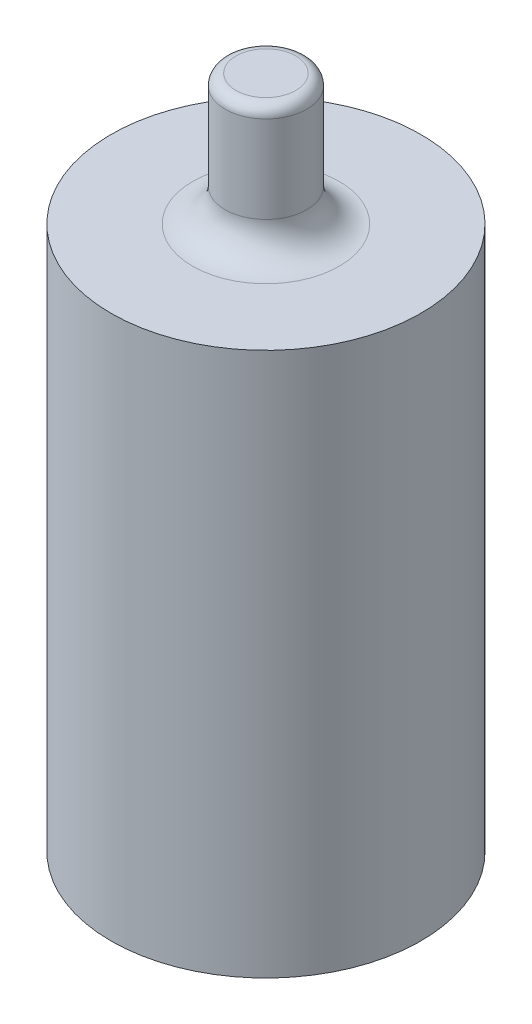
ISO-10303-21;
HEADER;
FILE_DESCRIPTION(('STEP AP214'),'2;1');
FILE_NAME('part.step','',(''),(''),'','','');
FILE_SCHEMA(('AUTOMOTIVE_DESIGN { 1 0 10303 214 1 1 1 1 }'));
ENDSEC;
DATA;
#1=APPLICATION_CONTEXT('core data for automotive mechanical design processes');
#2=APPLICATION_PROTOCOL_DEFINITION('international standard','automotive_design',2000,#1);
#3=PRODUCT_CONTEXT('',#1,'mechanical');
#4=PRODUCT('Part','Part','',(#3));
#5=PRODUCT_RELATED_PRODUCT_CATEGORY('part','',(#4));
#6=PRODUCT_DEFINITION_FORMATION('','',#4);
#7=PRODUCT_DEFINITION_CONTEXT('part definition',#1,'design');
#8=PRODUCT_DEFINITION('design','',#6,#7);
#9=PRODUCT_DEFINITION_SHAPE('','',#8);
#10=(LENGTH_UNIT() NAMED_UNIT(*) SI_UNIT(.MILLI.,.METRE.));
#11=(NAMED_UNIT(*) PLANE_ANGLE_UNIT() SI_UNIT($,.RADIAN.));
#12=(NAMED_UNIT(*) SI_UNIT($,.STERADIAN.) SOLID_ANGLE_UNIT());
#13=UNCERTAINTY_MEASURE_WITH_UNIT(LENGTH_MEASURE(1.E-05),#10,'distance_accuracy_value','');
#14=(GEOMETRIC_REPRESENTATION_CONTEXT(3) GLOBAL_UNCERTAINTY_ASSIGNED_CONTEXT((#13)) GLOBAL_UNIT_ASSIGNED_CONTEXT((#10,
#11,#12)) REPRESENTATION_CONTEXT('',''));
#15=CARTESIAN_POINT('',(0.,0.,0.));
#16=DIRECTION('',(0.,0.,1.));
#17=DIRECTION('',(1.,0.,0.));
#18=AXIS2_PLACEMENT_3D('',#15,#16,#17);
#19=CARTESIAN_POINT('',(0.,50.,0.));
#20=DIRECTION('',(0.,-1.,0.));
#21=DIRECTION('',(0.,0.,-1.));
#22=AXIS2_PLACEMENT_3D('',#19,#20,#21);
#23=CYLINDRICAL_SURFACE('',#22,14.25);
#24=CARTESIAN_POINT('',(0.,50.,0.));
#25=DIRECTION('',(0.,1.,0.));
#26=DIRECTION('',(0.,0.,1.));
#27=AXIS2_PLACEMENT_3D('',#24,#25,#26);
#28=CIRCLE('',#27,14.25);
#29=CARTESIAN_POINT('',(0.,50.,14.25));
#30=VERTEX_POINT('',#29);
#31=EDGE_CURVE('E55',#30,#30,#28,.T.);
#32=ORIENTED_EDGE('',*,*,#31,.F.);
#33=EDGE_LOOP('',(#32));
#34=FACE_BOUND('',#33,.T.);
#35=CARTESIAN_POINT('',(0.,0.,0.));
#36=DIRECTION('',(0.,1.,0.));
#37=DIRECTION('',(0.,0.,1.));
#38=AXIS2_PLACEMENT_3D('',#35,#36,#37);
#39=CIRCLE('',#38,14.25);
#40=CARTESIAN_POINT('',(0.,0.,14.25));
#41=VERTEX_POINT('',#40);
#42=EDGE_CURVE('E56',#41,#41,#39,.T.);
#43=ORIENTED_EDGE('',*,*,#42,.T.);
#44=EDGE_LOOP('',(#43));
#45=FACE_BOUND('',#44,.T.);
#46=ADVANCED_FACE('F35',(#34,#45),#23,.T.);
#47=CARTESIAN_POINT('',(0.,50.,0.));
#48=DIRECTION('',(0.,1.,0.));
#49=DIRECTION('',(0.,0.,1.));
#50=AXIS2_PLACEMENT_3D('',#47,#48,#49);
#51=PLANE('',#50);
#52=CARTESIAN_POINT('',(0.,50.,0.));
#53=DIRECTION('',(0.,1.,0.));
#54=DIRECTION('',(0.,0.,1.));
#55=AXIS2_PLACEMENT_3D('',#52,#53,#54);
#56=CIRCLE('',#55,6.75);
#57=CARTESIAN_POINT('',(0.,50.,6.75));
#58=VERTEX_POINT('',#57);
#59=EDGE_CURVE('E46',#58,#58,#56,.F.);
#60=ORIENTED_EDGE('',*,*,#59,.T.);
#61=EDGE_LOOP('',(#60));
#62=FACE_BOUND('',#61,.T.);
#63=ORIENTED_EDGE('',*,*,#31,.T.);
#64=EDGE_LOOP('',(#63));
#65=FACE_BOUND('',#64,.T.);
#66=ADVANCED_FACE('F80',(#62,#65),#51,.T.);
#67=CARTESIAN_POINT('',(0.,0.,0.));
#68=DIRECTION('',(0.,1.,0.));
#69=DIRECTION('',(0.,0.,1.));
#70=AXIS2_PLACEMENT_3D('',#67,#68,#69);
#71=PLANE('',#70);
#72=CARTESIAN_POINT('',(0.,0.,0.));
#73=DIRECTION('',(0.,-1.,0.));
#74=DIRECTION('',(0.,0.,-1.));
#75=AXIS2_PLACEMENT_3D('',#72,#73,#74);
#76=CIRCLE('',#75,12.6354307667516);
#77=CARTESIAN_POINT('',(0.,0.,-12.6354307667516));
#78=VERTEX_POINT('',#77);
#79=EDGE_CURVE('E62',#78,#78,#76,.T.);
#80=ORIENTED_EDGE('',*,*,#79,.F.);
#81=EDGE_LOOP('',(#80));
#82=FACE_BOUND('',#81,.T.);
#83=ORIENTED_EDGE('',*,*,#42,.F.);
#84=EDGE_LOOP('',(#83));
#85=FACE_BOUND('',#84,.T.);
#86=ADVANCED_FACE('F76',(#82,#85),#71,.F.);
#87=CARTESIAN_POINT('',(0.,62.,0.));
#88=DIRECTION('',(0.,-1.,0.));
#89=DIRECTION('',(0.,0.,-1.));
#90=AXIS2_PLACEMENT_3D('',#87,#88,#89);
#91=CYLINDRICAL_SURFACE('',#90,3.75);
#92=CARTESIAN_POINT('',(0.,61.,0.));
#93=DIRECTION('',(0.,1.,0.));
#94=DIRECTION('',(0.,0.,1.));
#95=AXIS2_PLACEMENT_3D('',#92,#93,#94);
#96=CIRCLE('',#95,3.75);
#97=CARTESIAN_POINT('',(0.,61.,3.75));
#98=VERTEX_POINT('',#97);
#99=EDGE_CURVE('E10',#98,#98,#96,.F.);
#100=ORIENTED_EDGE('',*,*,#99,.T.);
#101=EDGE_LOOP('',(#100));
#102=FACE_BOUND('',#101,.T.);
#103=CARTESIAN_POINT('',(0.,53.,0.));
#104=DIRECTION('',(0.,1.,0.));
#105=DIRECTION('',(0.,0.,1.));
#106=AXIS2_PLACEMENT_3D('',#103,#104,#105);
#107=CIRCLE('',#106,3.75);
#108=CARTESIAN_POINT('',(0.,53.,3.75));
#109=VERTEX_POINT('',#108);
#110=EDGE_CURVE('E50',#109,#109,#107,.T.);
#111=ORIENTED_EDGE('',*,*,#110,.T.);
#112=EDGE_LOOP('',(#111));
#113=FACE_BOUND('',#112,.T.);
#114=ADVANCED_FACE('F79',(#102,#113),#91,.T.);
#115=CARTESIAN_POINT('',(0.,62.,0.));
#116=DIRECTION('',(0.,1.,0.));
#117=DIRECTION('',(0.,0.,1.));
#118=AXIS2_PLACEMENT_3D('',#115,#116,#117);
#119=PLANE('',#118);
#120=CARTESIAN_POINT('',(0.,62.,0.));
#121=DIRECTION('',(0.,1.,0.));
#122=DIRECTION('',(0.,0.,1.));
#123=AXIS2_PLACEMENT_3D('',#120,#121,#122);
#124=CIRCLE('',#123,2.75);
#125=CARTESIAN_POINT('',(0.,62.,2.75));
#126=VERTEX_POINT('',#125);
#127=EDGE_CURVE('E42',#126,#126,#124,.T.);
#128=ORIENTED_EDGE('',*,*,#127,.T.);
#129=EDGE_LOOP('',(#128));
#130=FACE_BOUND('',#129,.T.);
#131=ADVANCED_FACE('F95',(#130),#119,.T.);
#132=CARTESIAN_POINT('',(0.,53.,0.));
#133=DIRECTION('',(0.,1.,0.));
#134=DIRECTION('',(0.,0.,1.));
#135=AXIS2_PLACEMENT_3D('',#132,#133,#134);
#136=TOROIDAL_SURFACE('',#135,6.75,3.);
#137=ORIENTED_EDGE('',*,*,#59,.F.);
#138=EDGE_LOOP('',(#137));
#139=FACE_BOUND('',#138,.T.);
#140=ORIENTED_EDGE('',*,*,#110,.F.);
#141=EDGE_LOOP('',(#140));
#142=FACE_BOUND('',#141,.T.);
#143=ADVANCED_FACE('F93',(#139,#142),#136,.F.);
#144=CARTESIAN_POINT('',(0.,61.,0.));
#145=DIRECTION('',(0.,1.,0.));
#146=DIRECTION('',(0.,0.,1.));
#147=AXIS2_PLACEMENT_3D('',#144,#145,#146);
#148=TOROIDAL_SURFACE('',#147,2.75,1.);
#149=ORIENTED_EDGE('',*,*,#99,.F.);
#150=EDGE_LOOP('',(#149));
#151=FACE_BOUND('',#150,.T.);
#152=ORIENTED_EDGE('',*,*,#127,.F.);
#153=EDGE_LOOP('',(#152));
#154=FACE_BOUND('',#153,.T.);
#155=ADVANCED_FACE('F37',(#151,#154),#148,.T.);
#156=CARTESIAN_POINT('',(0.,47.,0.));
#157=DIRECTION('',(0.,-1.,0.));
#158=DIRECTION('',(0.,0.,-1.));
#159=AXIS2_PLACEMENT_3D('',#156,#157,#158);
#160=CYLINDRICAL_SURFACE('',#159,12.6354307667516);
#161=CARTESIAN_POINT('',(0.,47.,0.));
#162=DIRECTION('',(0.,-1.,0.));
#163=DIRECTION('',(0.,0.,-1.));
#164=AXIS2_PLACEMENT_3D('',#161,#162,#163);
#165=CIRCLE('',#164,12.6354307667516);
#166=CARTESIAN_POINT('',(0.,47.,-12.6354307667516));
#167=VERTEX_POINT('',#166);
#168=EDGE_CURVE('E59',#167,#167,#165,.T.);
#169=ORIENTED_EDGE('',*,*,#168,.F.);
#170=EDGE_LOOP('',(#169));
#171=FACE_BOUND('',#170,.T.);
#172=ORIENTED_EDGE('',*,*,#79,.T.);
#173=EDGE_LOOP('',(#172));
#174=FACE_BOUND('',#173,.T.);
#175=ADVANCED_FACE('F70',(#171,#174),#160,.F.);
#176=CARTESIAN_POINT('',(0.,47.,0.));
#177=DIRECTION('',(0.,-1.,0.));
#178=DIRECTION('',(0.,0.,-1.));
#179=AXIS2_PLACEMENT_3D('',#176,#177,#178);
#180=PLANE('',#179);
#181=ORIENTED_EDGE('',*,*,#168,.T.);
#182=EDGE_LOOP('',(#181));
#183=FACE_BOUND('',#182,.T.);
#184=ADVANCED_FACE('F68',(#183),#180,.T.);
#185=CLOSED_SHELL('',(#46,#66,#86,#114,#131,#143,#155,#175,#184));
#186=MANIFOLD_SOLID_BREP('B2',#185);
#187=ADVANCED_BREP_SHAPE_REPRESENTATION('',(#18,#186),#14);
#188=SHAPE_DEFINITION_REPRESENTATION(#9,#187);
ENDSEC;
END-ISO-10303-21;
